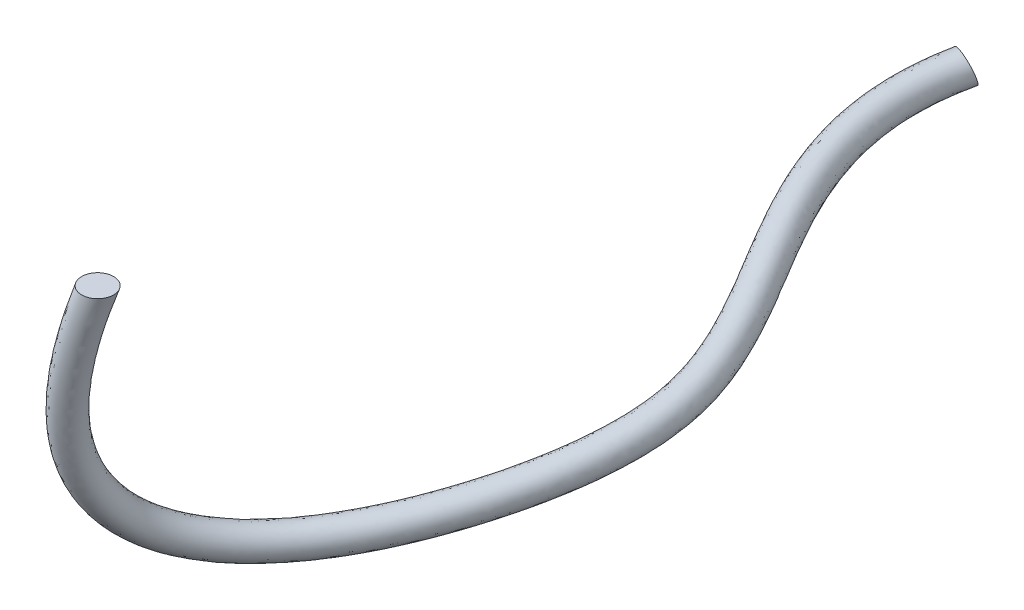
ISO-10303-21;
HEADER;
FILE_DESCRIPTION(('STEP AP214'),'2;1');
FILE_NAME('part.step','',(''),(''),'','','');
FILE_SCHEMA(('AUTOMOTIVE_DESIGN { 1 0 10303 214 1 1 1 1 }'));
ENDSEC;
DATA;
#1=APPLICATION_CONTEXT('core data for automotive mechanical design processes');
#2=APPLICATION_PROTOCOL_DEFINITION('international standard','automotive_design',2000,#1);
#3=PRODUCT_CONTEXT('',#1,'mechanical');
#4=PRODUCT('Part','Part','',(#3));
#5=PRODUCT_RELATED_PRODUCT_CATEGORY('part','',(#4));
#6=PRODUCT_DEFINITION_FORMATION('','',#4);
#7=PRODUCT_DEFINITION_CONTEXT('part definition',#1,'design');
#8=PRODUCT_DEFINITION('design','',#6,#7);
#9=PRODUCT_DEFINITION_SHAPE('','',#8);
#10=(LENGTH_UNIT() NAMED_UNIT(*) SI_UNIT(.MILLI.,.METRE.));
#11=(NAMED_UNIT(*) PLANE_ANGLE_UNIT() SI_UNIT($,.RADIAN.));
#12=(NAMED_UNIT(*) SI_UNIT($,.STERADIAN.) SOLID_ANGLE_UNIT());
#13=UNCERTAINTY_MEASURE_WITH_UNIT(LENGTH_MEASURE(1.E-05),#10,'distance_accuracy_value','');
#14=(GEOMETRIC_REPRESENTATION_CONTEXT(3) GLOBAL_UNCERTAINTY_ASSIGNED_CONTEXT((#13)) GLOBAL_UNIT_ASSIGNED_CONTEXT((#10,
#11,#12)) REPRESENTATION_CONTEXT('',''));
#15=CARTESIAN_POINT('',(0.,0.,0.));
#16=DIRECTION('',(0.,0.,1.));
#17=DIRECTION('',(1.,0.,0.));
#18=AXIS2_PLACEMENT_3D('',#15,#16,#17);
#19=CARTESIAN_POINT('',(0.,0.,0.));
#20=DIRECTION('',(0.,1.,0.));
#21=DIRECTION('',(0.,0.,1.));
#22=AXIS2_PLACEMENT_3D('',#19,#20,#21);
#23=PLANE('',#22);
#24=CARTESIAN_POINT('',(0.,0.,0.));
#25=DIRECTION('',(0.,1.,0.));
#26=DIRECTION('',(0.,0.,1.));
#27=AXIS2_PLACEMENT_3D('',#24,#25,#26);
#28=CIRCLE('',#27,15.);
#29=CARTESIAN_POINT('',(0.,0.,15.));
#30=VERTEX_POINT('',#29);
#31=EDGE_CURVE('E43',#30,#30,#28,.T.);
#32=ORIENTED_EDGE('',*,*,#31,.T.);
#33=EDGE_LOOP('',(#32));
#34=FACE_BOUND('',#33,.T.);
#35=ADVANCED_FACE('F40',(#34),#23,.T.);
#36=CARTESIAN_POINT('',(10.6937247251927,-218.658044188267,-805.773632206552));
#37=DIRECTION('',(-0.314111594689179,-0.3148865739469,0.895645215266516));
#38=DIRECTION('',(0.838475308767156,-0.534502233710034,0.106143858733334));
#39=AXIS2_PLACEMENT_3D('',#36,#37,#38);
#40=PLANE('',#39);
#41=CARTESIAN_POINT('',(10.6937247251927,-218.658044188267,-805.773632206552));
#42=DIRECTION('',(-0.314111594689179,-0.3148865739469,0.895645215266516));
#43=DIRECTION('',(0.838475308767156,-0.534502233710034,0.106143858733334));
#44=AXIS2_PLACEMENT_3D('',#41,#42,#43);
#45=CIRCLE('',#44,15.);
#46=CARTESIAN_POINT('',(23.2708543567,-226.675577693918,-804.181474325552));
#47=VERTEX_POINT('',#46);
#48=EDGE_CURVE('E10',#47,#47,#45,.T.);
#49=ORIENTED_EDGE('',*,*,#48,.F.);
#50=EDGE_LOOP('',(#49));
#51=FACE_BOUND('',#50,.T.);
#52=ADVANCED_FACE('F55',(#51),#40,.F.);
#53=CARTESIAN_POINT('',(0.,0.,15.));
#54=CARTESIAN_POINT('',(-11.4925828031156,-33.5986202661932,17.3873016025745));
#55=CARTESIAN_POINT('',(-19.7359235109882,-63.4387820207223,17.476792805504));
#56=CARTESIAN_POINT('',(-27.9271901413991,-103.28278655603,14.3602176607813));
#57=CARTESIAN_POINT('',(-29.9611142684579,-115.744858109268,12.7784606022659));
#58=CARTESIAN_POINT('',(-32.7390267391528,-139.136035076781,8.54929170303131));
#59=CARTESIAN_POINT('',(-33.4827678079774,-150.065767180949,5.90136959599851));
#60=CARTESIAN_POINT('',(-33.7753808696739,-170.468575061497,-0.441169287868453));
#61=CARTESIAN_POINT('',(-33.3235350230576,-179.941621482116,-4.13676056664429));
#62=CARTESIAN_POINT('',(-31.3262269746255,-197.464352600166,-12.5337476333893));
#63=CARTESIAN_POINT('',(-29.7802040290165,-205.512537306912,-17.2355492194347));
#64=CARTESIAN_POINT('',(-25.7246676433687,-220.197041761081,-27.5563461297126));
#65=CARTESIAN_POINT('',(-23.2157459394583,-226.831798643231,-33.1741817847458));
#66=CARTESIAN_POINT('',(-17.3957368324842,-238.733011137542,-45.200144786161));
#67=CARTESIAN_POINT('',(-14.085713953037,-243.999826059983,-51.6068962282893));
#68=CARTESIAN_POINT('',(-6.82682801058407,-253.264026820783,-65.0904422992056));
#69=CARTESIAN_POINT('',(-2.87827441743599,-257.26279393708,-72.1670193968397));
#70=CARTESIAN_POINT('',(5.5165429000348,-264.113503997142,-86.9037678474458));
#71=CARTESIAN_POINT('',(9.96320994377865,-266.966439968739,-94.5643334942756));
#72=CARTESIAN_POINT('',(19.2329752170033,-271.632048491056,-110.410709452585));
#73=CARTESIAN_POINT('',(24.0569240143248,-273.445128331688,-118.596711117744));
#74=CARTESIAN_POINT('',(31.4846057220365,-275.436478187859,-131.238358625835));
#75=CARTESIAN_POINT('',(33.9923864784829,-275.978547932906,-135.512790829061));
#76=CARTESIAN_POINT('',(37.1557555469135,-276.507037502352,-140.929230223993));
#77=CARTESIAN_POINT('',(37.7898542135395,-276.605275491593,-142.016191294848));
#78=CARTESIAN_POINT('',(39.0605881717381,-276.786889832662,-144.197416541456));
#79=CARTESIAN_POINT('',(39.7033120816134,-276.861755075105,-145.289634294653));
#80=CARTESIAN_POINT('',(40.9602435766039,-277.039565895967,-147.491656545957));
#81=CARTESIAN_POINT('',(41.5697488653249,-277.14959229817,-148.603056417173));
#82=CARTESIAN_POINT('',(42.7523592886306,-277.413273835043,-150.846950101811));
#83=CARTESIAN_POINT('',(43.3358201546644,-277.552094791974,-151.975950144689));
#84=CARTESIAN_POINT('',(53.3316902098661,-279.731187805622,-171.215296678721));
#85=CARTESIAN_POINT('',(62.9095438617727,-280.46512757071,-190.360479293467));
#86=CARTESIAN_POINT('',(81.4038670934136,-280.19699883785,-230.379431728846));
#87=CARTESIAN_POINT('',(90.32059930955,-279.194085814072,-251.253276936742));
#88=CARTESIAN_POINT('',(108.229038562526,-276.015798242682,-299.042332502246));
#89=CARTESIAN_POINT('',(116.870523508119,-273.618529061192,-326.412097302039));
#90=CARTESIAN_POINT('',(125.206122293456,-269.389936908363,-367.490751685989));
#91=CARTESIAN_POINT('',(127.212074604261,-267.874625327876,-381.189616219865));
#92=CARTESIAN_POINT('',(129.161980334279,-264.687433762394,-408.325918015272));
#93=CARTESIAN_POINT('',(129.106121542644,-263.015243280682,-421.765546575005));
#94=CARTESIAN_POINT('',(126.056668471442,-259.183590295836,-451.044846609682));
#95=CARTESIAN_POINT('',(122.449872527317,-257.039001038504,-466.447563612755));
#96=CARTESIAN_POINT('',(112.714868152887,-252.797673572609,-496.173938568597));
#97=CARTESIAN_POINT('',(106.590434402864,-250.700195441656,-510.505058438953));
#98=CARTESIAN_POINT('',(93.0574391862504,-246.63490447783,-538.637542699428));
#99=CARTESIAN_POINT('',(85.6468151407757,-244.666468114046,-552.442465751784));
#100=CARTESIAN_POINT('',(70.6601147010349,-240.931360415666,-580.058068219312));
#101=CARTESIAN_POINT('',(63.0833063265683,-239.164692109507,-593.868625148465));
#102=CARTESIAN_POINT('',(48.8249919693643,-235.905432788352,-621.97225983915));
#103=CARTESIAN_POINT('',(42.1440386144738,-234.413051873969,-636.263190137737));
#104=CARTESIAN_POINT('',(30.6787787878639,-231.770897483192,-665.783050583796));
#105=CARTESIAN_POINT('',(25.8931540917066,-230.621036118558,-681.008408448208));
#106=CARTESIAN_POINT('',(19.1572166672002,-228.725153032449,-712.922463207633));
#107=CARTESIAN_POINT('',(17.2018857797012,-227.978477361995,-729.611758192577));
#108=CARTESIAN_POINT('',(17.0991171174919,-226.954028224746,-765.120239986363));
#109=CARTESIAN_POINT('',(18.950932946038,-226.67609127458,-783.946009131821));
#110=CARTESIAN_POINT('',(23.2708543567,-226.675577693918,-804.181474325552));
#111=CARTESIAN_POINT('',(30.,0.,15.));
#112=CARTESIAN_POINT('',(18.5074171971275,-32.6152258139497,17.1884084066216));
#113=CARTESIAN_POINT('',(10.2212993095642,-61.2371281659792,17.199536396235));
#114=CARTESIAN_POINT('',(1.7480890770038,-98.8143336005758,14.3840708301677));
#115=CARTESIAN_POINT('',(-0.417773011839051,-110.448241839335,12.974455727389));
#116=CARTESIAN_POINT('',(-3.57933833242382,-132.059935664482,9.28614972324293));
#117=CARTESIAN_POINT('',(-4.5755512870003,-142.037686924999,7.00819014955353));
#118=CARTESIAN_POINT('',(-5.53772551762299,-160.488383412324,1.64038930892191));
#119=CARTESIAN_POINT('',(-5.50428909943899,-168.962306381533,-1.44878408622737));
#120=CARTESIAN_POINT('',(-4.52132328380756,-184.56963785611,-8.42224046598723));
#121=CARTESIAN_POINT('',(-3.57152642487089,-191.704795616263,-12.3071318399642));
#122=CARTESIAN_POINT('',(-0.8352062883032,-204.767808636499,-20.9011760442101));
#123=CARTESIAN_POINT('',(0.952703841419409,-210.696084038908,-25.6120800694636));
#124=CARTESIAN_POINT('',(5.29472465635653,-221.406508621369,-35.894452929153));
#125=CARTESIAN_POINT('',(7.84984736416558,-226.187313885918,-41.4666852644917));
#126=CARTESIAN_POINT('',(13.62253349934,-234.607786575954,-53.4694856944205));
#127=CARTESIAN_POINT('',(16.8401899342092,-238.24637288086,-59.8993755656309));
#128=CARTESIAN_POINT('',(23.7843668904495,-244.375156653631,-73.5762983896493));
#129=CARTESIAN_POINT('',(27.5110196028918,-246.865109560692,-80.8223701265245));
#130=CARTESIAN_POINT('',(35.2703406317489,-250.69700918077,-96.0804022388783));
#131=CARTESIAN_POINT('',(39.3037766484371,-252.038337846406,-104.091669076048));
#132=CARTESIAN_POINT('',(45.3852356786068,-253.200804824833,-116.656668854421));
#133=CARTESIAN_POINT('',(47.4170311335021,-253.446845670802,-120.93654684836));
#134=CARTESIAN_POINT('',(49.9368451138091,-253.581821815552,-126.39991214239));
#135=CARTESIAN_POINT('',(50.4397971435189,-253.600201721971,-127.498265992846));
#136=CARTESIAN_POINT('',(51.4429795932386,-253.619898822965,-129.706331675407));
#137=CARTESIAN_POINT('',(51.9358795352415,-253.600409007755,-130.822694114915));
#138=CARTESIAN_POINT('',(52.9551172043073,-253.649491097943,-133.033244007147));
#139=CARTESIAN_POINT('',(53.48802499178,-253.734696423592,-134.122000538385));
#140=CARTESIAN_POINT('',(54.6050310151551,-254.025554465346,-136.268459451663));
#141=CARTESIAN_POINT('',(55.1760208542917,-254.195417147838,-137.33767810845));
#142=CARTESIAN_POINT('',(64.828110724917,-256.76754200547,-155.676196261566));
#143=CARTESIAN_POINT('',(74.3184372141366,-257.844413022963,-174.288456141606));
#144=CARTESIAN_POINT('',(92.9643690918917,-258.103825553722,-213.693629675495));
#145=CARTESIAN_POINT('',(102.121489458283,-257.289389055401,-234.48782919347));
#146=CARTESIAN_POINT('',(120.82911027866,-254.342212877768,-282.558212653973));
#147=CARTESIAN_POINT('',(130.133002370002,-252.027116458479,-310.307943916622));
#148=CARTESIAN_POINT('',(139.802249469307,-247.824993020556,-352.58227032199));
#149=CARTESIAN_POINT('',(142.310136682656,-246.301636254061,-366.788432134898));
#150=CARTESIAN_POINT('',(145.341862468223,-243.048712413657,-395.26006206664));
#151=CARTESIAN_POINT('',(145.868215528065,-241.318573972162,-409.530140054664));
#152=CARTESIAN_POINT('',(144.062233760029,-237.278249293186,-441.140994799348));
#153=CARTESIAN_POINT('',(140.900061498178,-235.000742415827,-457.783837164055));
#154=CARTESIAN_POINT('',(131.712502593901,-230.511420464583,-489.573387060326));
#155=CARTESIAN_POINT('',(125.701335502758,-228.29917095119,-504.731735914132));
#156=CARTESIAN_POINT('',(112.263709291789,-224.041812440962,-534.051141833235));
#157=CARTESIAN_POINT('',(104.836227074867,-221.995399133613,-548.221293870776));
#158=CARTESIAN_POINT('',(89.7666071600804,-218.135500037447,-576.144005536583));
#159=CARTESIAN_POINT('',(82.1228653403602,-216.32178860224,-589.897179058815));
#160=CARTESIAN_POINT('',(67.6580891620416,-212.984499664008,-617.49780937356));
#161=CARTESIAN_POINT('',(60.8364295315931,-211.461075751683,-631.340841717485));
#162=CARTESIAN_POINT('',(48.9208869221826,-208.752675080518,-659.633649937393));
#163=CARTESIAN_POINT('',(43.8218201065474,-207.567197724732,-674.077606147082));
#164=CARTESIAN_POINT('',(36.1883791192802,-205.576314466826,-704.260862379532));
#165=CARTESIAN_POINT('',(33.6449456000312,-204.769717961333,-720.00496526922));
#166=CARTESIAN_POINT('',(32.1277425690467,-203.599254070747,-753.718216449686));
#167=CARTESIAN_POINT('',(33.1574322493984,-203.235693313542,-771.700355052481));
#168=CARTESIAN_POINT('',(36.6298871211884,-203.146055239429,-791.223935336182));
#169=CARTESIAN_POINT('',(30.,0.,-15.));
#170=CARTESIAN_POINT('',(18.3085240015089,-31.3739885798633,-12.8115915938038));
#171=CARTESIAN_POINT('',(9.8389939500163,-58.5375117284055,-12.7314847169001));
#172=CARTESIAN_POINT('',(0.987212175950926,-93.4476593781114,-15.1361747976165));
#173=CARTESIAN_POINT('',(-1.32383066527826,-104.112414077416,-16.3554535086967));
#174=CARTESIAN_POINT('',(-4.86210257953696,-123.629265264392,-19.4972750589416));
#175=CARTESIAN_POINT('',(-6.09033592512024,-132.480074045834,-21.4180660379817));
#176=CARTESIAN_POINT('',(-7.66724798999281,-148.582584281044,-25.8443638894796));
#177=CARTESIAN_POINT('',(-8.01796469365625,-155.835322187045,-28.3472538865431));
#178=CARTESIAN_POINT('',(-8.00598211078734,-169.054246919872,-33.9034836377965));
#179=CARTESIAN_POINT('',(-7.64413684958931,-175.025182980443,-36.9566201851796));
#180=CARTESIAN_POINT('',(-6.28063055392426,-186.005576343307,-43.7204420923989));
#181=CARTESIAN_POINT('',(-5.27639919442334,-191.018579517796,-47.4351979852565));
#182=CARTESIAN_POINT('',(-2.63048235237104,-200.272009893517,-55.713091676219));
#183=CARTESIAN_POINT('',(-0.985655799547263,-204.51037455798,-60.2797447834918));
#184=CARTESIAN_POINT('',(2.90985724667224,-212.236625811741,-70.4004265080202));
#185=CARTESIAN_POINT('',(5.16125568772992,-215.720668723871,-75.9542119647126));
#186=CARTESIAN_POINT('',(10.1441106040954,-221.900669538261,-88.081589218922));
#187=CARTESIAN_POINT('',(12.8748926321046,-224.59439682332,-94.6534312130677));
#188=CARTESIAN_POINT('',(18.6017387534555,-229.195881409974,-108.783091927772));
#189=CARTESIAN_POINT('',(21.5968694113946,-231.102206083362,-116.339834401919));
#190=CARTESIAN_POINT('',(26.0805859710133,-233.440979324525,-128.376234912645));
#191=CARTESIAN_POINT('',(27.5732323266557,-234.134594745594,-132.505226632623));
#192=CARTESIAN_POINT('',(29.413448806699,-234.909076550882,-137.808446096451));
#193=CARTESIAN_POINT('',(29.780212886504,-235.059369549823,-138.876187412008));
#194=CARTESIAN_POINT('',(30.510611656622,-235.351219968553,-141.025753949024));
#195=CARTESIAN_POINT('',(30.8547386324433,-235.4889925977,-142.118322623099));
#196=CARTESIAN_POINT('',(31.6376314470227,-235.775462399456,-144.263249733741));
#197=CARTESIAN_POINT('',(32.0923719390553,-235.926631344791,-145.30698650256));
#198=CARTESIAN_POINT('',(33.1295150665272,-236.241602291965,-147.338162350237));
#199=CARTESIAN_POINT('',(33.6780978423031,-236.399282616151,-148.344105245169));
#200=CARTESIAN_POINT('',(42.8221789024313,-238.954867412268,-165.656622646392));
#201=CARTESIAN_POINT('',(51.9007437009882,-240.072548209927,-183.372167484374));
#202=CARTESIAN_POINT('',(69.8226696284765,-240.449296483066,-221.020656524671));
#203=CARTESIAN_POINT('',(78.6670204619235,-239.713074994779,-240.954735817571));
#204=CARTESIAN_POINT('',(96.7803307947472,-236.946559362749,-287.065966221756));
#205=CARTESIAN_POINT('',(105.721171450802,-234.765630241719,-313.455293135542));
#206=CARTESIAN_POINT('',(115.02155584348,-230.889882854584,-352.846500692718));
#207=CARTESIAN_POINT('',(117.438726252601,-229.496837889742,-365.947247088569));
#208=CARTESIAN_POINT('',(120.477125185392,-226.565249162791,-391.834251762489));
#209=CARTESIAN_POINT('',(121.100492618595,-225.026755027789,-404.620737317591));
#210=CARTESIAN_POINT('',(119.968127508436,-221.494151816687,-432.492809895541));
#211=CARTESIAN_POINT('',(117.392375488199,-219.471652575801,-447.37064599191));
#212=CARTESIAN_POINT('',(109.332304800163,-215.378587730768,-476.446216636005));
#213=CARTESIAN_POINT('',(103.854656321258,-213.3090675314,-490.640668666838));
#214=CARTESIAN_POINT('',(91.1550734803107,-209.229137677846,-518.703538484958));
#215=CARTESIAN_POINT('',(83.9362411762048,-207.218670775202,-532.573933916929));
#216=CARTESIAN_POINT('',(68.908504446007,-203.347791753311,-560.451197631599));
#217=CARTESIAN_POINT('',(61.0994598571719,-201.487147929866,-574.458924777097));
#218=CARTESIAN_POINT('',(45.9980799682614,-197.997853649634,-603.123030064904));
#219=CARTESIAN_POINT('',(38.704014139395,-196.368936583499,-617.779278676669));
#220=CARTESIAN_POINT('',(25.7258999282934,-193.423705444865,-648.295760532927));
#221=CARTESIAN_POINT('',(20.0393041570267,-192.107066550472,-664.157318667369));
#222=CARTESIAN_POINT('',(11.4266438342498,-189.87490833865,-697.67617288181));
#223=CARTESIAN_POINT('',(8.50155625255191,-188.959506318293,-715.337075645292));
#224=CARTESIAN_POINT('',(6.66264933236236,-187.631711094694,-753.005046522087));
#225=CARTESIAN_POINT('',(7.75378197931789,-187.219951489934,-773.011940280334));
#226=CARTESIAN_POINT('',(11.4756278581737,-187.110988228128,-794.408251098182));
#227=CARTESIAN_POINT('',(0.,0.,-15.));
#228=CARTESIAN_POINT('',(-11.6914759987342,-32.3573830321068,-12.612698397851));
#229=CARTESIAN_POINT('',(-20.1182288704905,-60.7391655830572,-12.454228307631));
#230=CARTESIAN_POINT('',(-28.6880670424748,-97.9161123336112,-15.160027967003));
#231=CARTESIAN_POINT('',(-30.8671719218971,-109.409030347429,-16.5514486338099));
#232=CARTESIAN_POINT('',(-34.0217909862659,-130.705364676611,-20.2341330791631));
#233=CARTESIAN_POINT('',(-34.9975524460974,-140.508154301854,-22.524886591528));
#234=CARTESIAN_POINT('',(-35.9049033420437,-158.562775930147,-27.9259224862787));
#235=CARTESIAN_POINT('',(-35.8372106172749,-166.814637287627,-31.0352303669521));
#236=CARTESIAN_POINT('',(-34.8108858016053,-181.948961663927,-38.0149908052064));
#237=CARTESIAN_POINT('',(-33.8528144537423,-188.832924671092,-41.8850375646427));
#238=CARTESIAN_POINT('',(-31.1700919089824,-201.434809467889,-50.3756121779087));
#239=CARTESIAN_POINT('',(-29.444848975301,-207.154294122119,-54.9972997005744));
#240=CARTESIAN_POINT('',(-25.3209438412118,-217.59851240969,-65.0187835331912));
#241=CARTESIAN_POINT('',(-22.9212171167643,-222.322886732102,-70.4199557472894));
#242=CARTESIAN_POINT('',(-17.5395042632374,-230.892866056513,-82.0213831128053));
#243=CARTESIAN_POINT('',(-14.5572086639115,-234.737089780091,-88.2218557959214));
#244=CARTESIAN_POINT('',(-8.12371338632303,-241.639016881772,-101.409058676719));
#245=CARTESIAN_POINT('',(-4.67291702700848,-244.695727231303,-108.395394580819));
#246=CARTESIAN_POINT('',(2.56437333870983,-250.130920720323,-123.113399141479));
#247=CARTESIAN_POINT('',(6.35001677727404,-252.508996568512,-130.844876443615));
#248=CARTESIAN_POINT('',(12.1799560144471,-255.676652687617,-142.957924684059));
#249=CARTESIAN_POINT('',(14.148587671628,-256.666297007664,-147.081470613324));
#250=CARTESIAN_POINT('',(16.6323592398055,-257.834292237691,-152.337764178054));
#251=CARTESIAN_POINT('',(17.1302699565257,-258.06444331947,-153.394112714011));
#252=CARTESIAN_POINT('',(18.1282202351204,-258.518210978223,-155.516838815074));
#253=CARTESIAN_POINT('',(18.6221711788162,-258.750338665067,-156.585262802836));
#254=CARTESIAN_POINT('',(19.6427578193183,-259.165537197462,-158.721662272551));
#255=CARTESIAN_POINT('',(20.1740958126002,-259.341527219369,-159.788042381348));
#256=CARTESIAN_POINT('',(21.2768433400027,-259.629321661661,-161.916653000385));
#257=CARTESIAN_POINT('',(21.8378971426759,-259.755960260279,-162.982377281408));
#258=CARTESIAN_POINT('',(31.3257583873804,-261.91851321256,-181.195723063546));
#259=CARTESIAN_POINT('',(40.4918503486617,-262.693262757674,-199.444190636235));
#260=CARTESIAN_POINT('',(58.262167629961,-262.542469767193,-237.706458578022));
#261=CARTESIAN_POINT('',(66.8661303131902,-261.617771753136,-257.72018356053));
#262=CARTESIAN_POINT('',(84.1802590786132,-258.620144728045,-303.550086070411));
#263=CARTESIAN_POINT('',(92.4586925891073,-256.357042844244,-329.559446520959));
#264=CARTESIAN_POINT('',(100.425428667536,-252.454826742486,-367.754982056717));
#265=CARTESIAN_POINT('',(102.34066417425,-251.069826963556,-380.348431173535));
#266=CARTESIAN_POINT('',(104.297243051403,-248.203970511529,-404.900107711121));
#267=CARTESIAN_POINT('',(104.338398633217,-246.723424336309,-416.856143837932));
#268=CARTESIAN_POINT('',(101.962562219796,-243.399492819337,-442.396661705875));
#269=CARTESIAN_POINT('',(98.9421865173905,-241.509911198582,-456.034372440818));
#270=CARTESIAN_POINT('',(90.334670359097,-237.66484083869,-483.046768144068));
#271=CARTESIAN_POINT('',(84.7437552213378,-235.710092021866,-496.413991191659));
#272=CARTESIAN_POINT('',(71.9488033747987,-231.822229714714,-523.289939351151));
#273=CARTESIAN_POINT('',(64.7468292421131,-229.889739755744,-536.795105797937));
#274=CARTESIAN_POINT('',(49.8020119869614,-226.143652131421,-564.365260314328));
#275=CARTESIAN_POINT('',(42.059900843408,-224.330051437246,-578.430370866748));
#276=CARTESIAN_POINT('',(27.1649827755561,-220.918786773865,-607.597480530494));
#277=CARTESIAN_POINT('',(20.0116232223187,-219.320912705556,-622.701627097379));
#278=CARTESIAN_POINT('',(7.48379179393175,-216.441927847769,-654.445161178872));
#279=CARTESIAN_POINT('',(2.11063814217102,-215.160904944297,-671.088120968495));
#280=CARTESIAN_POINT('',(-5.60451861781533,-213.023746904273,-706.337773709911));
#281=CARTESIAN_POINT('',(-7.94150356778629,-212.168265719215,-724.943868568649));
#282=CARTESIAN_POINT('',(-8.36597611918435,-210.986485248433,-764.407070058764));
#283=CARTESIAN_POINT('',(-6.45271732401446,-210.660349450371,-785.257594359673));
#284=CARTESIAN_POINT('',(-1.88340490631467,-210.640510682617,-807.365790087552));
#285=CARTESIAN_POINT('',(-30.,0.,-15.));
#286=CARTESIAN_POINT('',(-41.6914759989773,-33.3407774843502,-12.4138052018981));
#287=CARTESIAN_POINT('',(-50.0754516909972,-62.9408194377089,-12.176971898362));
#288=CARTESIAN_POINT('',(-58.3633462609006,-102.384565289111,-15.1838811363894));
#289=CARTESIAN_POINT('',(-60.410513178516,-114.705646617442,-16.7474437589231));
#290=CARTESIAN_POINT('',(-63.1814793929948,-137.78146408883,-20.9709910993847));
#291=CARTESIAN_POINT('',(-63.9047689670745,-148.536234557874,-23.6317071450743));
#292=CARTESIAN_POINT('',(-64.1425586940945,-168.542967579251,-30.0074810830778));
#293=CARTESIAN_POINT('',(-63.6564565408936,-177.79395238821,-33.7232068473612));
#294=CARTESIAN_POINT('',(-61.6157894924232,-194.843676407983,-42.1264979726163));
#295=CARTESIAN_POINT('',(-60.0614920578952,-202.640666361741,-46.8134549441059));
#296=CARTESIAN_POINT('',(-56.0595532640406,-216.864042592471,-57.0307822634185));
#297=CARTESIAN_POINT('',(-53.6132987561787,-223.290008726443,-62.5594014158923));
#298=CARTESIAN_POINT('',(-48.0114053300526,-234.925014925864,-74.3244753901635));
#299=CARTESIAN_POINT('',(-44.8567784339813,-240.135398906225,-80.5601667110869));
#300=CARTESIAN_POINT('',(-37.988865773147,-249.549106301284,-93.6423397175904));
#301=CARTESIAN_POINT('',(-34.2756730155529,-253.753510836312,-100.48949962713));
#302=CARTESIAN_POINT('',(-26.3915373767415,-261.377364225284,-114.736528134515));
#303=CARTESIAN_POINT('',(-22.2207266861216,-264.797057639287,-122.13735794857));
#304=CARTESIAN_POINT('',(-13.4729920760358,-271.065960030671,-137.443706355186));
#305=CARTESIAN_POINT('',(-8.89683585684652,-273.915787053662,-145.349918485311));
#306=CARTESIAN_POINT('',(-1.72067394211907,-277.912326050709,-157.539614455472));
#307=CARTESIAN_POINT('',(0.723943016600271,-279.197999269734,-161.657714594026));
#308=CARTESIAN_POINT('',(3.85126967291209,-280.7595079245,-166.867082259657));
#309=CARTESIAN_POINT('',(4.48032702654738,-281.069517089118,-167.912038016013));
#310=CARTESIAN_POINT('',(5.74582881361884,-281.685201987894,-170.007923681124));
#311=CARTESIAN_POINT('',(6.38960372518916,-282.011684732434,-171.052202982574));
#312=CARTESIAN_POINT('',(7.6478841916139,-282.555611995469,-173.18007481136));
#313=CARTESIAN_POINT('',(8.25581968614507,-282.756423093947,-174.269098260135));
#314=CARTESIAN_POINT('',(9.42417161347818,-283.017041031357,-176.495143650533));
#315=CARTESIAN_POINT('',(9.99769644304862,-283.112637904406,-177.620649317647));
#316=CARTESIAN_POINT('',(19.8293378723294,-284.882159012851,-196.7348234807));
#317=CARTESIAN_POINT('',(29.0829569963352,-285.313977305422,-215.516213788096));
#318=CARTESIAN_POINT('',(46.7016656314455,-284.635643051321,-254.392260631372));
#319=CARTESIAN_POINT('',(55.0652401644569,-283.522468511493,-274.485631303488));
#320=CARTESIAN_POINT('',(71.5801873624793,-280.293730093341,-320.034205919065));
#321=CARTESIAN_POINT('',(79.1962137274123,-277.948455446769,-345.663599906375));
#322=CARTESIAN_POINT('',(85.829301491591,-274.019770630388,-382.663463420715));
#323=CARTESIAN_POINT('',(87.2426020958998,-272.642816037371,-394.749615258501));
#324=CARTESIAN_POINT('',(88.1173609174141,-269.842691860266,-417.965963659753));
#325=CARTESIAN_POINT('',(87.5763046478397,-268.420093644829,-429.091550358273));
#326=CARTESIAN_POINT('',(83.9569969311558,-265.304833821986,-452.300513516209));
#327=CARTESIAN_POINT('',(80.4919975465816,-263.548169821364,-464.698098889727));
#328=CARTESIAN_POINT('',(71.3370359180306,-259.951093946612,-489.64731965213));
#329=CARTESIAN_POINT('',(65.6328541214174,-258.111116512332,-502.18731371648));
#330=CARTESIAN_POINT('',(52.7425332692868,-254.415321751581,-527.876340217343));
#331=CARTESIAN_POINT('',(45.5574173080215,-252.560808736287,-541.016277678944));
#332=CARTESIAN_POINT('',(30.6955195279159,-248.939512509531,-568.279322997057));
#333=CARTESIAN_POINT('',(23.0203418296442,-247.172954944625,-582.401816956398));
#334=CARTESIAN_POINT('',(8.33188558285078,-243.839719898096,-612.071930996084));
#335=CARTESIAN_POINT('',(1.31923230524234,-242.272888827613,-627.623975518089));
#336=CARTESIAN_POINT('',(-10.7583163404299,-239.460150250673,-660.594561824817));
#337=CARTESIAN_POINT('',(-15.8180278726847,-238.214743338123,-678.018923269621));
#338=CARTESIAN_POINT('',(-22.6356810698804,-236.172585469896,-714.999374538011));
#339=CARTESIAN_POINT('',(-24.3845633881245,-235.377025120138,-734.550661492006));
#340=CARTESIAN_POINT('',(-23.3946015707311,-234.341259402171,-775.809093595441));
#341=CARTESIAN_POINT('',(-20.6592166273468,-234.100747410809,-797.503248439013));
#342=CARTESIAN_POINT('',(-15.2424376708031,-234.170033137105,-820.323329076923));
#343=CARTESIAN_POINT('',(-30.,0.,15.));
#344=CARTESIAN_POINT('',(-41.4925828033588,-34.5820147184367,17.5861947985274));
#345=CARTESIAN_POINT('',(-49.6931463315407,-65.6404358754653,17.7540492147731));
#346=CARTESIAN_POINT('',(-57.602469359802,-107.751239511484,14.3363644913949));
#347=CARTESIAN_POINT('',(-59.5044555250768,-121.041474379202,12.5824654771428));
#348=CARTESIAN_POINT('',(-61.8987151458817,-146.212134489079,7.81243368281969));
#349=CARTESIAN_POINT('',(-62.3899843289546,-158.093847436899,4.7945490424435));
#350=CARTESIAN_POINT('',(-62.0130362217247,-180.44876671067,-2.52272788465881));
#351=CARTESIAN_POINT('',(-61.1427809466763,-190.920936582699,-6.82473704706121));
#352=CARTESIAN_POINT('',(-58.1311306654434,-210.359067344222,-16.6452548007913));
#353=CARTESIAN_POINT('',(-55.9888816331621,-219.320278997562,-22.1639665989052));
#354=CARTESIAN_POINT('',(-50.6141289984342,-235.626274885664,-34.2115162152151));
#355=CARTESIAN_POINT('',(-47.3841957203359,-242.967513247555,-40.736283500028));
#356=CARTESIAN_POINT('',(-40.086198321325,-256.059513653716,-54.5058366431689));
#357=CARTESIAN_POINT('',(-36.0212752702396,-261.812338234048,-61.7471071920869));
#358=CARTESIAN_POINT('',(-27.2761895205081,-271.920267065612,-76.7113989039907));
#359=CARTESIAN_POINT('',(-22.5967387690812,-276.279214993301,-84.4346632280485));
#360=CARTESIAN_POINT('',(-12.7512810903799,-283.851851340654,-100.231237305242));
#361=CARTESIAN_POINT('',(-7.58459971533446,-287.067770376785,-108.306296862027));
#362=CARTESIAN_POINT('',(3.19560980225765,-292.567087801342,-124.741016666292));
#363=CARTESIAN_POINT('',(8.8100713802125,-294.85191881697,-133.10175315944));
#364=CARTESIAN_POINT('',(17.5839757654662,-297.672151550885,-145.820048397249));
#365=CARTESIAN_POINT('',(20.5677418234636,-298.51025019501,-150.089034809763));
#366=CARTESIAN_POINT('',(24.374665980018,-299.432253189153,-155.458548305595));
#367=CARTESIAN_POINT('',(25.1399112835601,-299.610349261214,-156.534116596851));
#368=CARTESIAN_POINT('',(26.6781967502376,-299.953880842358,-158.688501407506));
#369=CARTESIAN_POINT('',(27.4707446279852,-300.123101142455,-159.756574474391));
#370=CARTESIAN_POINT('',(28.9653699489006,-300.429640693991,-161.950069084767));
#371=CARTESIAN_POINT('',(29.6514727388698,-300.564488172748,-163.08411229596));
#372=CARTESIAN_POINT('',(30.8996875621061,-300.800993204739,-165.42544075196));
#373=CARTESIAN_POINT('',(31.4956194550371,-300.90877243611,-166.614222180929));
#374=CARTESIAN_POINT('',(41.8352696948151,-302.694833605775,-186.754397095875));
#375=CARTESIAN_POINT('',(51.5006505094088,-303.085842118457,-206.432502445329));
#376=CARTESIAN_POINT('',(69.8433650949355,-302.290172121978,-247.065233782196));
#377=CARTESIAN_POINT('',(78.5197091608167,-301.098782572742,-268.018724680014));
#378=CARTESIAN_POINT('',(95.6289668463924,-297.689383607596,-315.526452350519));
#379=CARTESIAN_POINT('',(103.608044646236,-295.209941663905,-342.516250687455));
#380=CARTESIAN_POINT('',(110.609995117606,-290.954880796171,-382.399233049987));
#381=CARTESIAN_POINT('',(112.114012525865,-289.44761440169,-395.590800304831));
#382=CARTESIAN_POINT('',(112.982098200335,-286.326155111132,-421.391773963903));
#383=CARTESIAN_POINT('',(112.344027557223,-284.711912589202,-434.000953095346));
#384=CARTESIAN_POINT('',(108.051103182855,-281.088931298485,-460.948698420016));
#385=CARTESIAN_POINT('',(103.999683556456,-279.077259661182,-475.111290061455));
#386=CARTESIAN_POINT('',(93.7172337118725,-275.083926680636,-502.774490076869));
#387=CARTESIAN_POINT('',(87.4795333029702,-273.101219932122,-516.278380963773));
#388=CARTESIAN_POINT('',(73.8511690807118,-269.227996514698,-543.22394356562));
#389=CARTESIAN_POINT('',(66.4574032066841,-267.337537094479,-556.663637632791));
#390=CARTESIAN_POINT('',(51.5536222419893,-263.727220793886,-583.972130902041));
#391=CARTESIAN_POINT('',(44.0437473127764,-262.007595616775,-597.840071238115));
#392=CARTESIAN_POINT('',(29.991894776687,-258.826365912695,-626.44671030474));
#393=CARTESIAN_POINT('',(23.4516476973545,-257.365027996255,-641.185538557988));
#394=CARTESIAN_POINT('',(12.4366706535452,-254.789119885867,-671.932451230199));
#395=CARTESIAN_POINT('',(7.96448807686584,-253.674874512383,-687.939210749334));
#396=CARTESIAN_POINT('',(2.12605421512013,-251.873991598072,-721.584064035733));
#397=CARTESIAN_POINT('',(0.758825959371129,-251.187236762658,-739.218551115935));
#398=CARTESIAN_POINT('',(2.07049166593703,-250.308802378744,-776.52226352304));
#399=CARTESIAN_POINT('',(4.74443364267747,-250.116489235617,-796.19166321116));
#400=CARTESIAN_POINT('',(9.91182159221161,-250.205100148406,-817.139013314923));
#401=CARTESIAN_POINT('',(0.,0.,15.));
#402=CARTESIAN_POINT('',(-11.4925828031156,-33.5986202661932,17.3873016025745));
#403=CARTESIAN_POINT('',(-19.7359235109882,-63.4387820207223,17.476792805504));
#404=CARTESIAN_POINT('',(-27.9271901413991,-103.28278655603,14.3602176607813));
#405=CARTESIAN_POINT('',(-29.9611142684579,-115.744858109268,12.7784606022659));
#406=CARTESIAN_POINT('',(-32.7390267391528,-139.136035076781,8.54929170303131));
#407=CARTESIAN_POINT('',(-33.4827678079774,-150.065767180949,5.90136959599851));
#408=CARTESIAN_POINT('',(-33.7753808696739,-170.468575061497,-0.441169287868453));
#409=CARTESIAN_POINT('',(-33.3235350230576,-179.941621482116,-4.13676056664429));
#410=CARTESIAN_POINT('',(-31.3262269746255,-197.464352600166,-12.5337476333893));
#411=CARTESIAN_POINT('',(-29.7802040290165,-205.512537306912,-17.2355492194347));
#412=CARTESIAN_POINT('',(-25.7246676433687,-220.197041761081,-27.5563461297126));
#413=CARTESIAN_POINT('',(-23.2157459394583,-226.831798643231,-33.1741817847458));
#414=CARTESIAN_POINT('',(-17.3957368324842,-238.733011137542,-45.200144786161));
#415=CARTESIAN_POINT('',(-14.085713953037,-243.999826059983,-51.6068962282893));
#416=CARTESIAN_POINT('',(-6.82682801058407,-253.264026820783,-65.0904422992056));
#417=CARTESIAN_POINT('',(-2.87827441743599,-257.26279393708,-72.1670193968397));
#418=CARTESIAN_POINT('',(5.5165429000348,-264.113503997142,-86.9037678474458));
#419=CARTESIAN_POINT('',(9.96320994377865,-266.966439968739,-94.5643334942756));
#420=CARTESIAN_POINT('',(19.2329752170033,-271.632048491056,-110.410709452585));
#421=CARTESIAN_POINT('',(24.0569240143248,-273.445128331688,-118.596711117744));
#422=CARTESIAN_POINT('',(31.4846057220365,-275.436478187859,-131.238358625835));
#423=CARTESIAN_POINT('',(33.9923864784829,-275.978547932906,-135.512790829061));
#424=CARTESIAN_POINT('',(37.1557555469135,-276.507037502352,-140.929230223993));
#425=CARTESIAN_POINT('',(37.7898542135395,-276.605275491593,-142.016191294848));
#426=CARTESIAN_POINT('',(39.0605881717381,-276.786889832662,-144.197416541456));
#427=CARTESIAN_POINT('',(39.7033120816134,-276.861755075105,-145.289634294653));
#428=CARTESIAN_POINT('',(40.9602435766039,-277.039565895967,-147.491656545957));
#429=CARTESIAN_POINT('',(41.5697488653249,-277.14959229817,-148.603056417173));
#430=CARTESIAN_POINT('',(42.7523592886306,-277.413273835043,-150.846950101811));
#431=CARTESIAN_POINT('',(43.3358201546644,-277.552094791974,-151.975950144689));
#432=CARTESIAN_POINT('',(53.3316902098661,-279.731187805622,-171.215296678721));
#433=CARTESIAN_POINT('',(62.9095438617727,-280.46512757071,-190.360479293467));
#434=CARTESIAN_POINT('',(81.4038670934136,-280.19699883785,-230.379431728846));
#435=CARTESIAN_POINT('',(90.32059930955,-279.194085814072,-251.253276936742));
#436=CARTESIAN_POINT('',(108.229038562526,-276.015798242682,-299.042332502246));
#437=CARTESIAN_POINT('',(116.870523508119,-273.618529061192,-326.412097302039));
#438=CARTESIAN_POINT('',(125.206122293456,-269.389936908363,-367.490751685989));
#439=CARTESIAN_POINT('',(127.212074604261,-267.874625327876,-381.189616219865));
#440=CARTESIAN_POINT('',(129.161980334279,-264.687433762394,-408.325918015272));
#441=CARTESIAN_POINT('',(129.106121542644,-263.015243280682,-421.765546575005));
#442=CARTESIAN_POINT('',(126.056668471442,-259.183590295836,-451.044846609682));
#443=CARTESIAN_POINT('',(122.449872527317,-257.039001038504,-466.447563612755));
#444=CARTESIAN_POINT('',(112.714868152887,-252.797673572609,-496.173938568597));
#445=CARTESIAN_POINT('',(106.590434402864,-250.700195441656,-510.505058438953));
#446=CARTESIAN_POINT('',(93.0574391862504,-246.63490447783,-538.637542699428));
#447=CARTESIAN_POINT('',(85.6468151407757,-244.666468114046,-552.442465751784));
#448=CARTESIAN_POINT('',(70.6601147010349,-240.931360415666,-580.058068219312));
#449=CARTESIAN_POINT('',(63.0833063265683,-239.164692109507,-593.868625148465));
#450=CARTESIAN_POINT('',(48.8249919693643,-235.905432788352,-621.97225983915));
#451=CARTESIAN_POINT('',(42.1440386144738,-234.413051873969,-636.263190137737));
#452=CARTESIAN_POINT('',(30.6787787878639,-231.770897483192,-665.783050583796));
#453=CARTESIAN_POINT('',(25.8931540917066,-230.621036118558,-681.008408448208));
#454=CARTESIAN_POINT('',(19.1572166672002,-228.725153032449,-712.922463207633));
#455=CARTESIAN_POINT('',(17.2018857797012,-227.978477361995,-729.611758192577));
#456=CARTESIAN_POINT('',(17.0991171174919,-226.954028224746,-765.120239986363));
#457=CARTESIAN_POINT('',(18.950932946038,-226.67609127458,-783.946009131821));
#458=CARTESIAN_POINT('',(23.2708543567,-226.675577693918,-804.181474325552));
#459=(BOUNDED_SURFACE() B_SPLINE_SURFACE(3,3,((#53,#54,#55,#56,#57,#58,#59,#60,#61,#62,#63,#64,
#65,#66,#67,#68,#69,#70,#71,#72,#73,#74,#75,#76,#77,#78,#79,#80,#81,#82,#83,#84,#85,#86,#87,#88,
#89,#90,#91,#92,#93,#94,#95,#96,#97,#98,#99,#100,#101,#102,#103,#104,#105,#106,#107,#108,#109,
#110),(#111,#112,#113,#114,#115,#116,#117,#118,#119,#120,#121,#122,#123,#124,#125,#126,#127,
#128,#129,#130,#131,#132,#133,#134,#135,#136,#137,#138,#139,#140,#141,#142,#143,#144,#145,#146,
#147,#148,#149,#150,#151,#152,#153,#154,#155,#156,#157,#158,#159,#160,#161,#162,#163,#164,#165,
#166,#167,#168),(#169,#170,#171,#172,#173,#174,#175,#176,#177,#178,#179,#180,#181,#182,#183,
#184,#185,#186,#187,#188,#189,#190,#191,#192,#193,#194,#195,#196,#197,#198,#199,#200,#201,#202,
#203,#204,#205,#206,#207,#208,#209,#210,#211,#212,#213,#214,#215,#216,#217,#218,#219,#220,#221,
#222,#223,#224,#225,#226),(#227,#228,#229,#230,#231,#232,#233,#234,#235,#236,#237,#238,#239,
#240,#241,#242,#243,#244,#245,#246,#247,#248,#249,#250,#251,#252,#253,#254,#255,#256,#257,#258,
#259,#260,#261,#262,#263,#264,#265,#266,#267,#268,#269,#270,#271,#272,#273,#274,#275,#276,#277,
#278,#279,#280,#281,#282,#283,#284),(#285,#286,#287,#288,#289,#290,#291,#292,#293,#294,#295,
#296,#297,#298,#299,#300,#301,#302,#303,#304,#305,#306,#307,#308,#309,#310,#311,#312,#313,#314,
#315,#316,#317,#318,#319,#320,#321,#322,#323,#324,#325,#326,#327,#328,#329,#330,#331,#332,#333,
#334,#335,#336,#337,#338,#339,#340,#341,#342),(#343,#344,#345,#346,#347,#348,#349,#350,#351,
#352,#353,#354,#355,#356,#357,#358,#359,#360,#361,#362,#363,#364,#365,#366,#367,#368,#369,#370,
#371,#372,#373,#374,#375,#376,#377,#378,#379,#380,#381,#382,#383,#384,#385,#386,#387,#388,#389,
#390,#391,#392,#393,#394,#395,#396,#397,#398,#399,#400),(#401,#402,#403,#404,#405,#406,#407,
#408,#409,#410,#411,#412,#413,#414,#415,#416,#417,#418,#419,#420,#421,#422,#423,#424,#425,#426,
#427,#428,#429,#430,#431,#432,#433,#434,#435,#436,#437,#438,#439,#440,#441,#442,#443,#444,#445,
#446,#447,#448,#449,#450,#451,#452,#453,#454,#455,#456,#457,#458)),.UNSPECIFIED.,.T.,.F.,
.F.) B_SPLINE_SURFACE_WITH_KNOTS((4,3,4),(4,2,2,2,2,2,2,2,2,2,2,2,2,2,2,2,2,2,2,2,2,2,2,2,2,2,2,
2,4),(0.,0.5,1.),(0.,0.0609877367897087,0.091481605184563,0.121975473579417,0.152469341974272,
0.182963210369126,0.21345707876398,0.243950947158835,0.274444815553689,0.304938683948543,
0.335432552343398,0.350679486540825,0.354491220090182,0.358302953639539,0.362114687188895,
0.365926420738252,0.426914157527961,0.487901894317669,0.562093026090901,0.599188591977516,
0.636284157864132,0.681748638131116,0.727213118398099,0.772677598665082,0.818142078932066,
0.86360655919905,0.909071039466033,0.954535519733017,1.),
.UNSPECIFIED.) GEOMETRIC_REPRESENTATION_ITEM() RATIONAL_B_SPLINE_SURFACE(((1.,1.,1.,1.,1.,1.,1.,
1.,1.,1.,1.,1.,1.,1.,1.,1.,1.,1.,1.,1.,1.,1.,1.,1.,1.,1.,1.,1.,1.,1.,1.,1.,1.,1.,1.,1.,1.,1.,1.,
1.,1.,1.,1.,1.,1.,1.,1.,1.,1.,1.,1.,1.,1.,1.,1.,1.,1.,1.),(0.333333333333333,0.333333333333333,
0.333333333333333,0.333333333333333,0.333333333333333,0.333333333333333,0.333333333333333,
0.333333333333333,0.333333333333333,0.333333333333333,0.333333333333333,0.333333333333333,
0.333333333333333,0.333333333333333,0.333333333333333,0.333333333333333,0.333333333333333,
0.333333333333333,0.333333333333333,0.333333333333333,0.333333333333333,0.333333333333333,
0.333333333333333,0.333333333333333,0.333333333333333,0.333333333333333,0.333333333333333,
0.333333333333333,0.333333333333333,0.333333333333333,0.333333333333333,0.333333333333333,
0.333333333333333,0.333333333333333,0.333333333333333,0.333333333333333,0.333333333333333,
0.333333333333333,0.333333333333333,0.333333333333333,0.333333333333333,0.333333333333333,
0.333333333333333,0.333333333333333,0.333333333333333,0.333333333333333,0.333333333333333,
0.333333333333333,0.333333333333333,0.333333333333333,0.333333333333333,0.333333333333333,
0.333333333333333,0.333333333333333,0.333333333333333,0.333333333333333,0.333333333333333,
0.333333333333333),(0.333333333333333,0.333333333333333,0.333333333333333,0.333333333333333,
0.333333333333333,0.333333333333333,0.333333333333333,0.333333333333333,0.333333333333333,
0.333333333333333,0.333333333333333,0.333333333333333,0.333333333333333,0.333333333333333,
0.333333333333333,0.333333333333333,0.333333333333333,0.333333333333333,0.333333333333333,
0.333333333333333,0.333333333333333,0.333333333333333,0.333333333333333,0.333333333333333,
0.333333333333333,0.333333333333333,0.333333333333333,0.333333333333333,0.333333333333333,
0.333333333333333,0.333333333333333,0.333333333333333,0.333333333333333,0.333333333333333,
0.333333333333333,0.333333333333333,0.333333333333333,0.333333333333333,0.333333333333333,
0.333333333333333,0.333333333333333,0.333333333333333,0.333333333333333,0.333333333333333,
0.333333333333333,0.333333333333333,0.333333333333333,0.333333333333333,0.333333333333333,
0.333333333333333,0.333333333333333,0.333333333333333,0.333333333333333,0.333333333333333,
0.333333333333333,0.333333333333333,0.333333333333333,0.333333333333333),(1.,1.,1.,1.,1.,1.,1.,
1.,1.,1.,1.,1.,1.,1.,1.,1.,1.,1.,1.,1.,1.,1.,1.,1.,1.,1.,1.,1.,1.,1.,1.,1.,1.,1.,1.,1.,1.,1.,1.,
1.,1.,1.,1.,1.,1.,1.,1.,1.,1.,1.,1.,1.,1.,1.,1.,1.,1.,1.),(0.333333333333333,0.333333333333333,
0.333333333333333,0.333333333333333,0.333333333333333,0.333333333333333,0.333333333333333,
0.333333333333333,0.333333333333333,0.333333333333333,0.333333333333333,0.333333333333333,
0.333333333333333,0.333333333333333,0.333333333333333,0.333333333333333,0.333333333333333,
0.333333333333333,0.333333333333333,0.333333333333333,0.333333333333333,0.333333333333333,
0.333333333333333,0.333333333333333,0.333333333333333,0.333333333333333,0.333333333333333,
0.333333333333333,0.333333333333333,0.333333333333333,0.333333333333333,0.333333333333333,
0.333333333333333,0.333333333333333,0.333333333333333,0.333333333333333,0.333333333333333,
0.333333333333333,0.333333333333333,0.333333333333333,0.333333333333333,0.333333333333333,
0.333333333333333,0.333333333333333,0.333333333333333,0.333333333333333,0.333333333333333,
0.333333333333333,0.333333333333333,0.333333333333333,0.333333333333333,0.333333333333333,
0.333333333333333,0.333333333333333,0.333333333333333,0.333333333333333,0.333333333333333,
0.333333333333333),(0.333333333333333,0.333333333333333,0.333333333333333,0.333333333333333,
0.333333333333333,0.333333333333333,0.333333333333333,0.333333333333333,0.333333333333333,
0.333333333333333,0.333333333333333,0.333333333333333,0.333333333333333,0.333333333333333,
0.333333333333333,0.333333333333333,0.333333333333333,0.333333333333333,0.333333333333333,
0.333333333333333,0.333333333333333,0.333333333333333,0.333333333333333,0.333333333333333,
0.333333333333333,0.333333333333333,0.333333333333333,0.333333333333333,0.333333333333333,
0.333333333333333,0.333333333333333,0.333333333333333,0.333333333333333,0.333333333333333,
0.333333333333333,0.333333333333333,0.333333333333333,0.333333333333333,0.333333333333333,
0.333333333333333,0.333333333333333,0.333333333333333,0.333333333333333,0.333333333333333,
0.333333333333333,0.333333333333333,0.333333333333333,0.333333333333333,0.333333333333333,
0.333333333333333,0.333333333333333,0.333333333333333,0.333333333333333,0.333333333333333,
0.333333333333333,0.333333333333333,0.333333333333333,0.333333333333333),(1.,1.,1.,1.,1.,1.,1.,
1.,1.,1.,1.,1.,1.,1.,1.,1.,1.,1.,1.,1.,1.,1.,1.,1.,1.,1.,1.,1.,1.,1.,1.,1.,1.,1.,1.,1.,1.,1.,1.,
1.,1.,1.,1.,1.,1.,1.,1.,1.,1.,1.,1.,1.,1.,1.,1.,1.,1.,1.))) REPRESENTATION_ITEM('') SURFACE());
#460=ORIENTED_EDGE('',*,*,#48,.T.);
#461=EDGE_LOOP('',(#460));
#462=FACE_BOUND('',#461,.T.);
#463=ORIENTED_EDGE('',*,*,#31,.F.);
#464=EDGE_LOOP('',(#463));
#465=FACE_BOUND('',#464,.T.);
#466=ADVANCED_FACE('F49',(#462,#465),#459,.F.);
#467=CLOSED_SHELL('',(#35,#52,#466));
#468=MANIFOLD_SOLID_BREP('B2',#467);
#469=ADVANCED_BREP_SHAPE_REPRESENTATION('',(#18,#468),#14);
#470=SHAPE_DEFINITION_REPRESENTATION(#9,#469);
ENDSEC;
END-ISO-10303-21;
